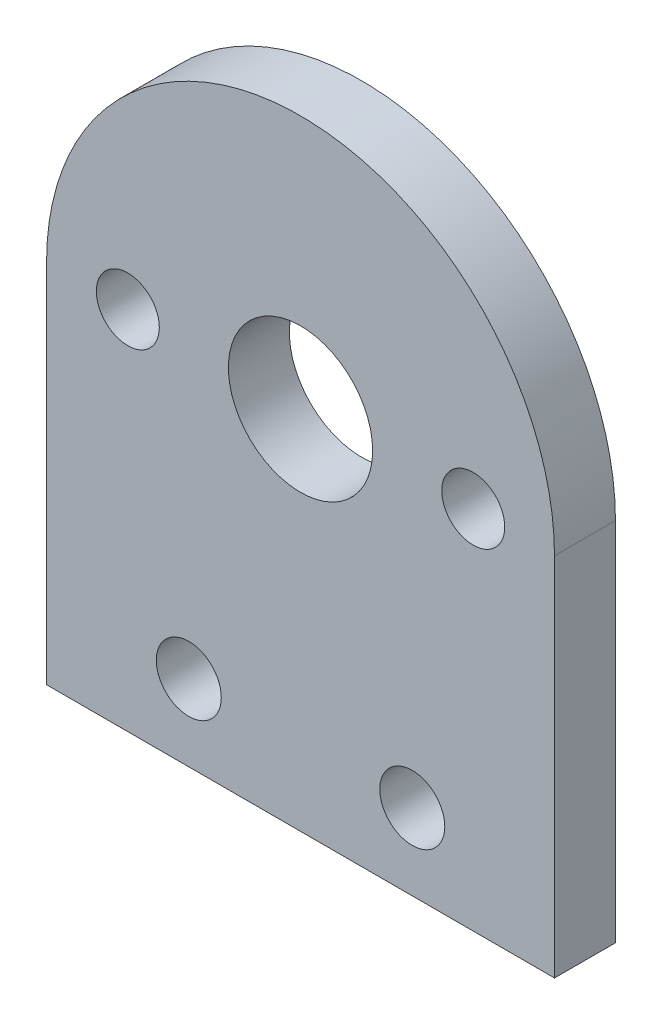
ISO-10303-21;
HEADER;
FILE_DESCRIPTION(('STEP AP214'),'2;1');
FILE_NAME('part.step','',(''),(''),'','','');
FILE_SCHEMA(('AUTOMOTIVE_DESIGN { 1 0 10303 214 1 1 1 1 }'));
ENDSEC;
DATA;
#1=APPLICATION_CONTEXT('core data for automotive mechanical design processes');
#2=APPLICATION_PROTOCOL_DEFINITION('international standard','automotive_design',2000,#1);
#3=PRODUCT_CONTEXT('',#1,'mechanical');
#4=PRODUCT('Part','Part','',(#3));
#5=PRODUCT_RELATED_PRODUCT_CATEGORY('part','',(#4));
#6=PRODUCT_DEFINITION_FORMATION('','',#4);
#7=PRODUCT_DEFINITION_CONTEXT('part definition',#1,'design');
#8=PRODUCT_DEFINITION('design','',#6,#7);
#9=PRODUCT_DEFINITION_SHAPE('','',#8);
#10=(LENGTH_UNIT() NAMED_UNIT(*) SI_UNIT(.MILLI.,.METRE.));
#11=(NAMED_UNIT(*) PLANE_ANGLE_UNIT() SI_UNIT($,.RADIAN.));
#12=(NAMED_UNIT(*) SI_UNIT($,.STERADIAN.) SOLID_ANGLE_UNIT());
#13=UNCERTAINTY_MEASURE_WITH_UNIT(LENGTH_MEASURE(1.E-05),#10,'distance_accuracy_value','');
#14=(GEOMETRIC_REPRESENTATION_CONTEXT(3) GLOBAL_UNCERTAINTY_ASSIGNED_CONTEXT((#13)) GLOBAL_UNIT_ASSIGNED_CONTEXT((#10,
#11,#12)) REPRESENTATION_CONTEXT('',''));
#15=CARTESIAN_POINT('',(0.,0.,0.));
#16=DIRECTION('',(0.,0.,1.));
#17=DIRECTION('',(1.,0.,0.));
#18=AXIS2_PLACEMENT_3D('',#15,#16,#17);
#19=CARTESIAN_POINT('',(-25.,18.,1.5));
#20=DIRECTION('',(1.,0.,0.));
#21=DIRECTION('',(0.,1.,0.));
#22=AXIS2_PLACEMENT_3D('',#19,#20,#21);
#23=PLANE('',#22);
#24=DIRECTION('',(0.,-1.,0.));
#25=VECTOR('',#24,1.);
#26=CARTESIAN_POINT('',(-25.,18.,-1.5));
#27=LINE('',#26,#25);
#28=CARTESIAN_POINT('',(-25.,18.,-1.5));
#29=VERTEX_POINT('',#28);
#30=CARTESIAN_POINT('',(-25.,0.,-1.5));
#31=VERTEX_POINT('',#30);
#32=EDGE_CURVE('E96',#29,#31,#27,.T.);
#33=ORIENTED_EDGE('',*,*,#32,.T.);
#34=DIRECTION('',(0.,0.,-1.));
#35=VECTOR('',#34,1.);
#36=CARTESIAN_POINT('',(-25.,0.,1.5));
#37=LINE('',#36,#35);
#38=CARTESIAN_POINT('',(-25.,0.,1.5));
#39=VERTEX_POINT('',#38);
#40=EDGE_CURVE('E11',#39,#31,#37,.T.);
#41=ORIENTED_EDGE('',*,*,#40,.F.);
#42=DIRECTION('',(0.,-1.,0.));
#43=VECTOR('',#42,1.);
#44=CARTESIAN_POINT('',(-25.,18.,1.5));
#45=LINE('',#44,#43);
#46=CARTESIAN_POINT('',(-25.,18.,1.5));
#47=VERTEX_POINT('',#46);
#48=EDGE_CURVE('E84',#47,#39,#45,.T.);
#49=ORIENTED_EDGE('',*,*,#48,.F.);
#50=DIRECTION('',(0.,0.,-1.));
#51=VECTOR('',#50,1.);
#52=CARTESIAN_POINT('',(-25.,18.,1.5));
#53=LINE('',#52,#51);
#54=EDGE_CURVE('E92',#47,#29,#53,.T.);
#55=ORIENTED_EDGE('',*,*,#54,.T.);
#56=EDGE_LOOP('',(#33,#41,#49,#55));
#57=FACE_BOUND('',#56,.T.);
#58=ADVANCED_FACE('F33',(#57),#23,.F.);
#59=CARTESIAN_POINT('',(-25.,0.,1.5));
#60=DIRECTION('',(0.,1.,0.));
#61=DIRECTION('',(0.,0.,1.));
#62=AXIS2_PLACEMENT_3D('',#59,#60,#61);
#63=PLANE('',#62);
#64=DIRECTION('',(1.,0.,0.));
#65=VECTOR('',#64,1.);
#66=CARTESIAN_POINT('',(-25.,0.,-1.5));
#67=LINE('',#66,#65);
#68=CARTESIAN_POINT('',(0.,0.,-1.5));
#69=VERTEX_POINT('',#68);
#70=EDGE_CURVE('E88',#31,#69,#67,.T.);
#71=ORIENTED_EDGE('',*,*,#70,.T.);
#72=DIRECTION('',(0.,0.,-1.));
#73=VECTOR('',#72,1.);
#74=CARTESIAN_POINT('',(0.,0.,1.5));
#75=LINE('',#74,#73);
#76=CARTESIAN_POINT('',(0.,0.,1.5));
#77=VERTEX_POINT('',#76);
#78=EDGE_CURVE('E41',#77,#69,#75,.T.);
#79=ORIENTED_EDGE('',*,*,#78,.F.);
#80=DIRECTION('',(1.,0.,0.));
#81=VECTOR('',#80,1.);
#82=CARTESIAN_POINT('',(-25.,0.,1.5));
#83=LINE('',#82,#81);
#84=EDGE_CURVE('E79',#39,#77,#83,.T.);
#85=ORIENTED_EDGE('',*,*,#84,.F.);
#86=ORIENTED_EDGE('',*,*,#40,.T.);
#87=EDGE_LOOP('',(#71,#79,#85,#86));
#88=FACE_BOUND('',#87,.T.);
#89=ADVANCED_FACE('F87',(#88),#63,.F.);
#90=CARTESIAN_POINT('',(0.,0.,1.5));
#91=DIRECTION('',(-1.,0.,0.));
#92=DIRECTION('',(0.,0.,1.));
#93=AXIS2_PLACEMENT_3D('',#90,#91,#92);
#94=PLANE('',#93);
#95=DIRECTION('',(0.,1.,0.));
#96=VECTOR('',#95,1.);
#97=CARTESIAN_POINT('',(0.,0.,-1.5));
#98=LINE('',#97,#96);
#99=CARTESIAN_POINT('',(0.,18.,-1.5));
#100=VERTEX_POINT('',#99);
#101=EDGE_CURVE('E66',#69,#100,#98,.T.);
#102=ORIENTED_EDGE('',*,*,#101,.T.);
#103=DIRECTION('',(0.,0.,-1.));
#104=VECTOR('',#103,1.);
#105=CARTESIAN_POINT('',(0.,18.,1.5));
#106=LINE('',#105,#104);
#107=CARTESIAN_POINT('',(0.,18.,1.5));
#108=VERTEX_POINT('',#107);
#109=EDGE_CURVE('E89',#108,#100,#106,.T.);
#110=ORIENTED_EDGE('',*,*,#109,.F.);
#111=DIRECTION('',(0.,1.,0.));
#112=VECTOR('',#111,1.);
#113=CARTESIAN_POINT('',(0.,0.,1.5));
#114=LINE('',#113,#112);
#115=EDGE_CURVE('E82',#77,#108,#114,.T.);
#116=ORIENTED_EDGE('',*,*,#115,.F.);
#117=ORIENTED_EDGE('',*,*,#78,.T.);
#118=EDGE_LOOP('',(#102,#110,#116,#117));
#119=FACE_BOUND('',#118,.T.);
#120=ADVANCED_FACE('F90',(#119),#94,.F.);
#121=CARTESIAN_POINT('',(-12.5,18.,1.5));
#122=DIRECTION('',(0.,0.,-1.));
#123=DIRECTION('',(-1.,0.,0.));
#124=AXIS2_PLACEMENT_3D('',#121,#122,#123);
#125=CYLINDRICAL_SURFACE('',#124,12.5);
#126=CARTESIAN_POINT('',(-12.5,18.,-1.5));
#127=DIRECTION('',(0.,0.,1.));
#128=DIRECTION('',(1.,0.,0.));
#129=AXIS2_PLACEMENT_3D('',#126,#127,#128);
#130=CIRCLE('',#129,12.5);
#131=EDGE_CURVE('E72',#100,#29,#130,.T.);
#132=ORIENTED_EDGE('',*,*,#131,.T.);
#133=ORIENTED_EDGE('',*,*,#54,.F.);
#134=CARTESIAN_POINT('',(-12.5,18.,1.5));
#135=DIRECTION('',(0.,0.,1.));
#136=DIRECTION('',(1.,0.,0.));
#137=AXIS2_PLACEMENT_3D('',#134,#135,#136);
#138=CIRCLE('',#137,12.5);
#139=EDGE_CURVE('E49',#108,#47,#138,.T.);
#140=ORIENTED_EDGE('',*,*,#139,.F.);
#141=ORIENTED_EDGE('',*,*,#109,.T.);
#142=EDGE_LOOP('',(#132,#133,#140,#141));
#143=FACE_BOUND('',#142,.T.);
#144=ADVANCED_FACE('F104',(#143),#125,.T.);
#145=CARTESIAN_POINT('',(-12.5,18.,1.5));
#146=DIRECTION('',(0.,0.,1.));
#147=DIRECTION('',(1.,0.,0.));
#148=AXIS2_PLACEMENT_3D('',#145,#146,#147);
#149=PLANE('',#148);
#150=CARTESIAN_POINT('',(-21.,18.,1.5));
#151=DIRECTION('',(0.,0.,1.));
#152=DIRECTION('',(1.,0.,0.));
#153=AXIS2_PLACEMENT_3D('',#150,#151,#152);
#154=CIRCLE('',#153,1.55);
#155=CARTESIAN_POINT('',(-19.45,18.,1.5));
#156=VERTEX_POINT('',#155);
#157=EDGE_CURVE('E125',#156,#156,#154,.T.);
#158=ORIENTED_EDGE('',*,*,#157,.F.);
#159=EDGE_LOOP('',(#158));
#160=FACE_BOUND('',#159,.T.);
#161=CARTESIAN_POINT('',(-4.,18.,1.5));
#162=DIRECTION('',(0.,0.,1.));
#163=DIRECTION('',(1.,0.,0.));
#164=AXIS2_PLACEMENT_3D('',#161,#162,#163);
#165=CIRCLE('',#164,1.55);
#166=CARTESIAN_POINT('',(-2.45,18.,1.5));
#167=VERTEX_POINT('',#166);
#168=EDGE_CURVE('E131',#167,#167,#165,.T.);
#169=ORIENTED_EDGE('',*,*,#168,.F.);
#170=EDGE_LOOP('',(#169));
#171=FACE_BOUND('',#170,.T.);
#172=CARTESIAN_POINT('',(-12.5,18.,1.5));
#173=DIRECTION('',(0.,0.,1.));
#174=DIRECTION('',(1.,0.,0.));
#175=AXIS2_PLACEMENT_3D('',#172,#173,#174);
#176=CIRCLE('',#175,3.55);
#177=CARTESIAN_POINT('',(-8.95,18.,1.5));
#178=VERTEX_POINT('',#177);
#179=EDGE_CURVE('E122',#178,#178,#176,.T.);
#180=ORIENTED_EDGE('',*,*,#179,.F.);
#181=EDGE_LOOP('',(#180));
#182=FACE_BOUND('',#181,.T.);
#183=CARTESIAN_POINT('',(-7.,3.75,1.5));
#184=DIRECTION('',(0.,0.,1.));
#185=DIRECTION('',(1.,0.,0.));
#186=AXIS2_PLACEMENT_3D('',#183,#184,#185);
#187=CIRCLE('',#186,1.6);
#188=CARTESIAN_POINT('',(-5.4,3.75,1.5));
#189=VERTEX_POINT('',#188);
#190=EDGE_CURVE('E116',#189,#189,#187,.T.);
#191=ORIENTED_EDGE('',*,*,#190,.F.);
#192=EDGE_LOOP('',(#191));
#193=FACE_BOUND('',#192,.T.);
#194=CARTESIAN_POINT('',(-18.,3.75,1.5));
#195=DIRECTION('',(0.,0.,1.));
#196=DIRECTION('',(1.,0.,0.));
#197=AXIS2_PLACEMENT_3D('',#194,#195,#196);
#198=CIRCLE('',#197,1.6);
#199=CARTESIAN_POINT('',(-16.4,3.75,1.5));
#200=VERTEX_POINT('',#199);
#201=EDGE_CURVE('E110',#200,#200,#198,.T.);
#202=ORIENTED_EDGE('',*,*,#201,.F.);
#203=EDGE_LOOP('',(#202));
#204=FACE_BOUND('',#203,.T.);
#205=ORIENTED_EDGE('',*,*,#48,.T.);
#206=ORIENTED_EDGE('',*,*,#84,.T.);
#207=ORIENTED_EDGE('',*,*,#115,.T.);
#208=ORIENTED_EDGE('',*,*,#139,.T.);
#209=EDGE_LOOP('',(#205,#206,#207,#208));
#210=FACE_BOUND('',#209,.T.);
#211=ADVANCED_FACE('F80',(#160,#171,#182,#193,#204,#210),#149,.T.);
#212=CARTESIAN_POINT('',(-12.5,18.,-1.5));
#213=DIRECTION('',(0.,0.,1.));
#214=DIRECTION('',(1.,0.,0.));
#215=AXIS2_PLACEMENT_3D('',#212,#213,#214);
#216=PLANE('',#215);
#217=CARTESIAN_POINT('',(-21.,18.,-1.5));
#218=DIRECTION('',(0.,0.,1.));
#219=DIRECTION('',(1.,0.,0.));
#220=AXIS2_PLACEMENT_3D('',#217,#218,#219);
#221=CIRCLE('',#220,1.55);
#222=CARTESIAN_POINT('',(-19.45,18.,-1.5));
#223=VERTEX_POINT('',#222);
#224=EDGE_CURVE('E134',#223,#223,#221,.T.);
#225=ORIENTED_EDGE('',*,*,#224,.T.);
#226=EDGE_LOOP('',(#225));
#227=FACE_BOUND('',#226,.T.);
#228=CARTESIAN_POINT('',(-4.,18.,-1.5));
#229=DIRECTION('',(0.,0.,1.));
#230=DIRECTION('',(1.,0.,0.));
#231=AXIS2_PLACEMENT_3D('',#228,#229,#230);
#232=CIRCLE('',#231,1.55);
#233=CARTESIAN_POINT('',(-2.45,18.,-1.5));
#234=VERTEX_POINT('',#233);
#235=EDGE_CURVE('E128',#234,#234,#232,.T.);
#236=ORIENTED_EDGE('',*,*,#235,.T.);
#237=EDGE_LOOP('',(#236));
#238=FACE_BOUND('',#237,.T.);
#239=CARTESIAN_POINT('',(-12.5,18.,-1.5));
#240=DIRECTION('',(0.,0.,1.));
#241=DIRECTION('',(1.,0.,0.));
#242=AXIS2_PLACEMENT_3D('',#239,#240,#241);
#243=CIRCLE('',#242,3.55);
#244=CARTESIAN_POINT('',(-8.95,18.,-1.5));
#245=VERTEX_POINT('',#244);
#246=EDGE_CURVE('E119',#245,#245,#243,.T.);
#247=ORIENTED_EDGE('',*,*,#246,.T.);
#248=EDGE_LOOP('',(#247));
#249=FACE_BOUND('',#248,.T.);
#250=CARTESIAN_POINT('',(-7.,3.75,-1.5));
#251=DIRECTION('',(0.,0.,1.));
#252=DIRECTION('',(1.,0.,0.));
#253=AXIS2_PLACEMENT_3D('',#250,#251,#252);
#254=CIRCLE('',#253,1.6);
#255=CARTESIAN_POINT('',(-5.4,3.75,-1.5));
#256=VERTEX_POINT('',#255);
#257=EDGE_CURVE('E113',#256,#256,#254,.T.);
#258=ORIENTED_EDGE('',*,*,#257,.T.);
#259=EDGE_LOOP('',(#258));
#260=FACE_BOUND('',#259,.T.);
#261=CARTESIAN_POINT('',(-18.,3.75,-1.5));
#262=DIRECTION('',(0.,0.,1.));
#263=DIRECTION('',(1.,0.,0.));
#264=AXIS2_PLACEMENT_3D('',#261,#262,#263);
#265=CIRCLE('',#264,1.6);
#266=CARTESIAN_POINT('',(-16.4,3.75,-1.5));
#267=VERTEX_POINT('',#266);
#268=EDGE_CURVE('E99',#267,#267,#265,.T.);
#269=ORIENTED_EDGE('',*,*,#268,.T.);
#270=EDGE_LOOP('',(#269));
#271=FACE_BOUND('',#270,.T.);
#272=ORIENTED_EDGE('',*,*,#32,.F.);
#273=ORIENTED_EDGE('',*,*,#131,.F.);
#274=ORIENTED_EDGE('',*,*,#101,.F.);
#275=ORIENTED_EDGE('',*,*,#70,.F.);
#276=EDGE_LOOP('',(#272,#273,#274,#275));
#277=FACE_BOUND('',#276,.T.);
#278=ADVANCED_FACE('F107',(#227,#238,#249,#260,#271,#277),#216,.F.);
#279=CARTESIAN_POINT('',(-18.,3.75,-1.5));
#280=DIRECTION('',(0.,0.,1.));
#281=DIRECTION('',(1.,0.,0.));
#282=AXIS2_PLACEMENT_3D('',#279,#280,#281);
#283=CYLINDRICAL_SURFACE('',#282,1.6);
#284=ORIENTED_EDGE('',*,*,#268,.F.);
#285=EDGE_LOOP('',(#284));
#286=FACE_BOUND('',#285,.T.);
#287=ORIENTED_EDGE('',*,*,#201,.T.);
#288=EDGE_LOOP('',(#287));
#289=FACE_BOUND('',#288,.T.);
#290=ADVANCED_FACE('F153',(#286,#289),#283,.F.);
#291=CARTESIAN_POINT('',(-7.,3.75,-1.5));
#292=DIRECTION('',(0.,0.,1.));
#293=DIRECTION('',(1.,0.,0.));
#294=AXIS2_PLACEMENT_3D('',#291,#292,#293);
#295=CYLINDRICAL_SURFACE('',#294,1.6);
#296=ORIENTED_EDGE('',*,*,#257,.F.);
#297=EDGE_LOOP('',(#296));
#298=FACE_BOUND('',#297,.T.);
#299=ORIENTED_EDGE('',*,*,#190,.T.);
#300=EDGE_LOOP('',(#299));
#301=FACE_BOUND('',#300,.T.);
#302=ADVANCED_FACE('F155',(#298,#301),#295,.F.);
#303=CARTESIAN_POINT('',(-12.5,18.,-1.5));
#304=DIRECTION('',(0.,0.,1.));
#305=DIRECTION('',(1.,0.,0.));
#306=AXIS2_PLACEMENT_3D('',#303,#304,#305);
#307=CYLINDRICAL_SURFACE('',#306,3.55);
#308=ORIENTED_EDGE('',*,*,#246,.F.);
#309=EDGE_LOOP('',(#308));
#310=FACE_BOUND('',#309,.T.);
#311=ORIENTED_EDGE('',*,*,#179,.T.);
#312=EDGE_LOOP('',(#311));
#313=FACE_BOUND('',#312,.T.);
#314=ADVANCED_FACE('F162',(#310,#313),#307,.F.);
#315=CARTESIAN_POINT('',(-4.,18.,-1.5));
#316=DIRECTION('',(0.,0.,1.));
#317=DIRECTION('',(1.,0.,0.));
#318=AXIS2_PLACEMENT_3D('',#315,#316,#317);
#319=CYLINDRICAL_SURFACE('',#318,1.55);
#320=ORIENTED_EDGE('',*,*,#235,.F.);
#321=EDGE_LOOP('',(#320));
#322=FACE_BOUND('',#321,.T.);
#323=ORIENTED_EDGE('',*,*,#168,.T.);
#324=EDGE_LOOP('',(#323));
#325=FACE_BOUND('',#324,.T.);
#326=ADVANCED_FACE('F201',(#322,#325),#319,.F.);
#327=CARTESIAN_POINT('',(-21.,18.,-1.5));
#328=DIRECTION('',(0.,0.,1.));
#329=DIRECTION('',(1.,0.,0.));
#330=AXIS2_PLACEMENT_3D('',#327,#328,#329);
#331=CYLINDRICAL_SURFACE('',#330,1.55);
#332=ORIENTED_EDGE('',*,*,#224,.F.);
#333=EDGE_LOOP('',(#332));
#334=FACE_BOUND('',#333,.T.);
#335=ORIENTED_EDGE('',*,*,#157,.T.);
#336=EDGE_LOOP('',(#335));
#337=FACE_BOUND('',#336,.T.);
#338=ADVANCED_FACE('F140',(#334,#337),#331,.F.);
#339=CLOSED_SHELL('',(#58,#89,#120,#144,#211,#278,#290,#302,#314,#326,#338));
#340=MANIFOLD_SOLID_BREP('B2',#339);
#341=ADVANCED_BREP_SHAPE_REPRESENTATION('',(#18,#340),#14);
#342=SHAPE_DEFINITION_REPRESENTATION(#9,#341);
ENDSEC;
END-ISO-10303-21;
